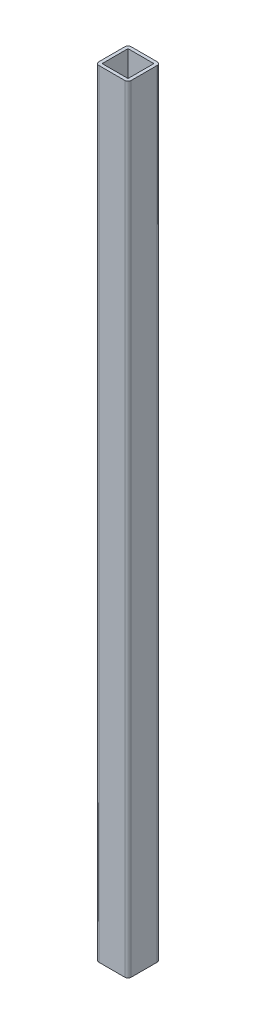
ISO-10303-21;
HEADER;
FILE_DESCRIPTION(('STEP AP214'),'2;1');
FILE_NAME('part.step','',(''),(''),'','','');
FILE_SCHEMA(('AUTOMOTIVE_DESIGN { 1 0 10303 214 1 1 1 1 }'));
ENDSEC;
DATA;
#1=APPLICATION_CONTEXT('core data for automotive mechanical design processes');
#2=APPLICATION_PROTOCOL_DEFINITION('international standard','automotive_design',2000,#1);
#3=PRODUCT_CONTEXT('',#1,'mechanical');
#4=PRODUCT('Part','Part','',(#3));
#5=PRODUCT_RELATED_PRODUCT_CATEGORY('part','',(#4));
#6=PRODUCT_DEFINITION_FORMATION('','',#4);
#7=PRODUCT_DEFINITION_CONTEXT('part definition',#1,'design');
#8=PRODUCT_DEFINITION('design','',#6,#7);
#9=PRODUCT_DEFINITION_SHAPE('','',#8);
#10=(LENGTH_UNIT() NAMED_UNIT(*) SI_UNIT(.MILLI.,.METRE.));
#11=(NAMED_UNIT(*) PLANE_ANGLE_UNIT() SI_UNIT($,.RADIAN.));
#12=(NAMED_UNIT(*) SI_UNIT($,.STERADIAN.) SOLID_ANGLE_UNIT());
#13=UNCERTAINTY_MEASURE_WITH_UNIT(LENGTH_MEASURE(1.E-05),#10,'distance_accuracy_value','');
#14=(GEOMETRIC_REPRESENTATION_CONTEXT(3) GLOBAL_UNCERTAINTY_ASSIGNED_CONTEXT((#13)) GLOBAL_UNIT_ASSIGNED_CONTEXT((#10,
#11,#12)) REPRESENTATION_CONTEXT('',''));
#15=CARTESIAN_POINT('',(0.,0.,0.));
#16=DIRECTION('',(0.,0.,1.));
#17=DIRECTION('',(1.,0.,0.));
#18=AXIS2_PLACEMENT_3D('',#15,#16,#17);
#19=CARTESIAN_POINT('',(12.7,609.6,-12.7));
#20=DIRECTION('',(0.,0.,1.));
#21=DIRECTION('',(1.,0.,0.));
#22=AXIS2_PLACEMENT_3D('',#19,#20,#21);
#23=PLANE('',#22);
#24=DIRECTION('',(-1.,0.,0.));
#25=VECTOR('',#24,1.);
#26=CARTESIAN_POINT('',(12.7,609.6,-12.7));
#27=LINE('',#26,#25);
#28=CARTESIAN_POINT('',(10.16,609.6,-12.7));
#29=VERTEX_POINT('',#28);
#30=CARTESIAN_POINT('',(-10.16,609.6,-12.7));
#31=VERTEX_POINT('',#30);
#32=EDGE_CURVE('E179',#29,#31,#27,.T.);
#33=ORIENTED_EDGE('',*,*,#32,.F.);
#34=DIRECTION('',(0.,-1.,0.));
#35=VECTOR('',#34,1.);
#36=CARTESIAN_POINT('',(10.16,0.,-12.7));
#37=LINE('',#36,#35);
#38=CARTESIAN_POINT('',(10.16,0.,-12.7));
#39=VERTEX_POINT('',#38);
#40=EDGE_CURVE('E11',#29,#39,#37,.T.);
#41=ORIENTED_EDGE('',*,*,#40,.T.);
#42=DIRECTION('',(-1.,0.,0.));
#43=VECTOR('',#42,1.);
#44=CARTESIAN_POINT('',(12.7,0.,-12.7));
#45=LINE('',#44,#43);
#46=CARTESIAN_POINT('',(-10.16,0.,-12.7));
#47=VERTEX_POINT('',#46);
#48=EDGE_CURVE('E196',#39,#47,#45,.T.);
#49=ORIENTED_EDGE('',*,*,#48,.T.);
#50=DIRECTION('',(0.,-1.,0.));
#51=VECTOR('',#50,1.);
#52=CARTESIAN_POINT('',(-10.16,609.6,-12.7));
#53=LINE('',#52,#51);
#54=EDGE_CURVE('E48',#47,#31,#53,.F.);
#55=ORIENTED_EDGE('',*,*,#54,.T.);
#56=EDGE_LOOP('',(#33,#41,#49,#55));
#57=FACE_BOUND('',#56,.T.);
#58=ADVANCED_FACE('F39',(#57),#23,.F.);
#59=CARTESIAN_POINT('',(-12.7,609.6,-12.7));
#60=DIRECTION('',(1.,0.,0.));
#61=DIRECTION('',(0.,0.,-1.));
#62=AXIS2_PLACEMENT_3D('',#59,#60,#61);
#63=PLANE('',#62);
#64=DIRECTION('',(0.,0.,1.));
#65=VECTOR('',#64,1.);
#66=CARTESIAN_POINT('',(-12.7,0.,-12.7));
#67=LINE('',#66,#65);
#68=CARTESIAN_POINT('',(-12.7,0.,-10.16));
#69=VERTEX_POINT('',#68);
#70=CARTESIAN_POINT('',(-12.7,0.,10.16));
#71=VERTEX_POINT('',#70);
#72=EDGE_CURVE('E200',#69,#71,#67,.T.);
#73=ORIENTED_EDGE('',*,*,#72,.T.);
#74=DIRECTION('',(0.,-1.,0.));
#75=VECTOR('',#74,1.);
#76=CARTESIAN_POINT('',(-12.7,609.6,10.16));
#77=LINE('',#76,#75);
#78=CARTESIAN_POINT('',(-12.7,609.6,10.16));
#79=VERTEX_POINT('',#78);
#80=EDGE_CURVE('E233',#71,#79,#77,.F.);
#81=ORIENTED_EDGE('',*,*,#80,.T.);
#82=DIRECTION('',(0.,0.,1.));
#83=VECTOR('',#82,1.);
#84=CARTESIAN_POINT('',(-12.7,609.6,-12.7));
#85=LINE('',#84,#83);
#86=CARTESIAN_POINT('',(-12.7,609.6,-10.16));
#87=VERTEX_POINT('',#86);
#88=EDGE_CURVE('E183',#87,#79,#85,.T.);
#89=ORIENTED_EDGE('',*,*,#88,.F.);
#90=DIRECTION('',(0.,-1.,0.));
#91=VECTOR('',#90,1.);
#92=CARTESIAN_POINT('',(-12.7,609.6,-10.16));
#93=LINE('',#92,#91);
#94=EDGE_CURVE('E229',#87,#69,#93,.T.);
#95=ORIENTED_EDGE('',*,*,#94,.T.);
#96=EDGE_LOOP('',(#73,#81,#89,#95));
#97=FACE_BOUND('',#96,.T.);
#98=ADVANCED_FACE('F266',(#97),#63,.F.);
#99=CARTESIAN_POINT('',(12.7,609.6,12.7));
#100=DIRECTION('',(0.,0.,1.));
#101=DIRECTION('',(1.,0.,0.));
#102=AXIS2_PLACEMENT_3D('',#99,#100,#101);
#103=PLANE('',#102);
#104=DIRECTION('',(-1.,0.,0.));
#105=VECTOR('',#104,1.);
#106=CARTESIAN_POINT('',(12.7,609.6,12.7));
#107=LINE('',#106,#105);
#108=CARTESIAN_POINT('',(10.16,609.6,12.7));
#109=VERTEX_POINT('',#108);
#110=CARTESIAN_POINT('',(-10.16,609.6,12.7));
#111=VERTEX_POINT('',#110);
#112=EDGE_CURVE('E188',#109,#111,#107,.T.);
#113=ORIENTED_EDGE('',*,*,#112,.T.);
#114=DIRECTION('',(0.,-1.,0.));
#115=VECTOR('',#114,1.);
#116=CARTESIAN_POINT('',(-10.16,0.,12.7));
#117=LINE('',#116,#115);
#118=CARTESIAN_POINT('',(-10.16,0.,12.7));
#119=VERTEX_POINT('',#118);
#120=EDGE_CURVE('E213',#111,#119,#117,.T.);
#121=ORIENTED_EDGE('',*,*,#120,.T.);
#122=DIRECTION('',(-1.,0.,0.));
#123=VECTOR('',#122,1.);
#124=CARTESIAN_POINT('',(12.7,0.,12.7));
#125=LINE('',#124,#123);
#126=CARTESIAN_POINT('',(10.16,0.,12.7));
#127=VERTEX_POINT('',#126);
#128=EDGE_CURVE('E204',#127,#119,#125,.T.);
#129=ORIENTED_EDGE('',*,*,#128,.F.);
#130=DIRECTION('',(0.,-1.,0.));
#131=VECTOR('',#130,1.);
#132=CARTESIAN_POINT('',(10.16,609.6,12.7));
#133=LINE('',#132,#131);
#134=EDGE_CURVE('E195',#127,#109,#133,.F.);
#135=ORIENTED_EDGE('',*,*,#134,.T.);
#136=EDGE_LOOP('',(#113,#121,#129,#135));
#137=FACE_BOUND('',#136,.T.);
#138=ADVANCED_FACE('F274',(#137),#103,.T.);
#139=CARTESIAN_POINT('',(12.7,609.6,-12.7));
#140=DIRECTION('',(1.,0.,0.));
#141=DIRECTION('',(0.,0.,-1.));
#142=AXIS2_PLACEMENT_3D('',#139,#140,#141);
#143=PLANE('',#142);
#144=DIRECTION('',(0.,0.,1.));
#145=VECTOR('',#144,1.);
#146=CARTESIAN_POINT('',(12.7,609.6,-12.7));
#147=LINE('',#146,#145);
#148=CARTESIAN_POINT('',(12.7,609.6,-10.16));
#149=VERTEX_POINT('',#148);
#150=CARTESIAN_POINT('',(12.7,609.6,10.16));
#151=VERTEX_POINT('',#150);
#152=EDGE_CURVE('E192',#149,#151,#147,.T.);
#153=ORIENTED_EDGE('',*,*,#152,.T.);
#154=DIRECTION('',(0.,-1.,0.));
#155=VECTOR('',#154,1.);
#156=CARTESIAN_POINT('',(12.7,609.6,10.16));
#157=LINE('',#156,#155);
#158=CARTESIAN_POINT('',(12.7,0.,10.16));
#159=VERTEX_POINT('',#158);
#160=EDGE_CURVE('E249',#151,#159,#157,.T.);
#161=ORIENTED_EDGE('',*,*,#160,.T.);
#162=DIRECTION('',(0.,0.,1.));
#163=VECTOR('',#162,1.);
#164=CARTESIAN_POINT('',(12.7,0.,-12.7));
#165=LINE('',#164,#163);
#166=CARTESIAN_POINT('',(12.7,0.,-10.16));
#167=VERTEX_POINT('',#166);
#168=EDGE_CURVE('E184',#167,#159,#165,.T.);
#169=ORIENTED_EDGE('',*,*,#168,.F.);
#170=DIRECTION('',(0.,-1.,0.));
#171=VECTOR('',#170,1.);
#172=CARTESIAN_POINT('',(12.7,609.6,-10.16));
#173=LINE('',#172,#171);
#174=EDGE_CURVE('E62',#167,#149,#173,.F.);
#175=ORIENTED_EDGE('',*,*,#174,.T.);
#176=EDGE_LOOP('',(#153,#161,#169,#175));
#177=FACE_BOUND('',#176,.T.);
#178=ADVANCED_FACE('F279',(#177),#143,.T.);
#179=CARTESIAN_POINT('',(0.,609.6,0.));
#180=DIRECTION('',(0.,1.,0.));
#181=DIRECTION('',(0.,0.,1.));
#182=AXIS2_PLACEMENT_3D('',#179,#180,#181);
#183=PLANE('',#182);
#184=DIRECTION('',(-1.,0.,0.));
#185=VECTOR('',#184,1.);
#186=CARTESIAN_POINT('',(12.7,609.6,-10.16));
#187=LINE('',#186,#185);
#188=CARTESIAN_POINT('',(10.16,609.6,-10.16));
#189=VERTEX_POINT('',#188);
#190=CARTESIAN_POINT('',(-10.16,609.6,-10.16));
#191=VERTEX_POINT('',#190);
#192=EDGE_CURVE('E160',#189,#191,#187,.T.);
#193=ORIENTED_EDGE('',*,*,#192,.F.);
#194=DIRECTION('',(0.,0.,1.));
#195=VECTOR('',#194,1.);
#196=CARTESIAN_POINT('',(10.16,609.6,-12.7));
#197=LINE('',#196,#195);
#198=CARTESIAN_POINT('',(10.16,609.6,10.16));
#199=VERTEX_POINT('',#198);
#200=EDGE_CURVE('E139',#189,#199,#197,.T.);
#201=ORIENTED_EDGE('',*,*,#200,.T.);
#202=DIRECTION('',(-1.,0.,0.));
#203=VECTOR('',#202,1.);
#204=CARTESIAN_POINT('',(12.7,609.6,10.16));
#205=LINE('',#204,#203);
#206=CARTESIAN_POINT('',(-10.16,609.6,10.16));
#207=VERTEX_POINT('',#206);
#208=EDGE_CURVE('E173',#199,#207,#205,.T.);
#209=ORIENTED_EDGE('',*,*,#208,.T.);
#210=DIRECTION('',(0.,0.,1.));
#211=VECTOR('',#210,1.);
#212=CARTESIAN_POINT('',(-10.16,609.6,-12.7));
#213=LINE('',#212,#211);
#214=EDGE_CURVE('E164',#191,#207,#213,.T.);
#215=ORIENTED_EDGE('',*,*,#214,.F.);
#216=EDGE_LOOP('',(#193,#201,#209,#215));
#217=FACE_BOUND('',#216,.T.);
#218=ORIENTED_EDGE('',*,*,#88,.T.);
#219=CARTESIAN_POINT('',(-10.16,609.6,10.16));
#220=DIRECTION('',(0.,1.,0.));
#221=DIRECTION('',(0.,0.,1.));
#222=AXIS2_PLACEMENT_3D('',#219,#220,#221);
#223=CIRCLE('',#222,2.54);
#224=EDGE_CURVE('E244',#79,#111,#223,.T.);
#225=ORIENTED_EDGE('',*,*,#224,.T.);
#226=ORIENTED_EDGE('',*,*,#112,.F.);
#227=CARTESIAN_POINT('',(10.16,609.6,10.16));
#228=DIRECTION('',(0.,1.,0.));
#229=DIRECTION('',(0.,0.,1.));
#230=AXIS2_PLACEMENT_3D('',#227,#228,#229);
#231=CIRCLE('',#230,2.54);
#232=EDGE_CURVE('E55',#109,#151,#231,.T.);
#233=ORIENTED_EDGE('',*,*,#232,.T.);
#234=ORIENTED_EDGE('',*,*,#152,.F.);
#235=CARTESIAN_POINT('',(10.16,609.6,-10.16));
#236=DIRECTION('',(0.,1.,0.));
#237=DIRECTION('',(0.,0.,1.));
#238=AXIS2_PLACEMENT_3D('',#235,#236,#237);
#239=CIRCLE('',#238,2.54);
#240=EDGE_CURVE('E239',#149,#29,#239,.T.);
#241=ORIENTED_EDGE('',*,*,#240,.T.);
#242=ORIENTED_EDGE('',*,*,#32,.T.);
#243=CARTESIAN_POINT('',(-10.16,609.6,-10.16));
#244=DIRECTION('',(0.,1.,0.));
#245=DIRECTION('',(0.,0.,1.));
#246=AXIS2_PLACEMENT_3D('',#243,#244,#245);
#247=CIRCLE('',#246,2.54);
#248=EDGE_CURVE('E236',#31,#87,#247,.T.);
#249=ORIENTED_EDGE('',*,*,#248,.T.);
#250=EDGE_LOOP('',(#218,#225,#226,#233,#234,#241,#242,#249));
#251=FACE_BOUND('',#250,.T.);
#252=ADVANCED_FACE('F260',(#217,#251),#183,.T.);
#253=CARTESIAN_POINT('',(0.,0.,0.));
#254=DIRECTION('',(0.,1.,0.));
#255=DIRECTION('',(0.,0.,1.));
#256=AXIS2_PLACEMENT_3D('',#253,#254,#255);
#257=PLANE('',#256);
#258=DIRECTION('',(0.,0.,1.));
#259=VECTOR('',#258,1.);
#260=CARTESIAN_POINT('',(10.16,0.,-12.7));
#261=LINE('',#260,#259);
#262=CARTESIAN_POINT('',(10.16,0.,-10.16));
#263=VERTEX_POINT('',#262);
#264=CARTESIAN_POINT('',(10.16,0.,10.16));
#265=VERTEX_POINT('',#264);
#266=EDGE_CURVE('E136',#263,#265,#261,.T.);
#267=ORIENTED_EDGE('',*,*,#266,.F.);
#268=DIRECTION('',(-1.,0.,0.));
#269=VECTOR('',#268,1.);
#270=CARTESIAN_POINT('',(12.7,0.,-10.16));
#271=LINE('',#270,#269);
#272=CARTESIAN_POINT('',(-10.16,0.,-10.16));
#273=VERTEX_POINT('',#272);
#274=EDGE_CURVE('E147',#263,#273,#271,.T.);
#275=ORIENTED_EDGE('',*,*,#274,.T.);
#276=DIRECTION('',(0.,0.,1.));
#277=VECTOR('',#276,1.);
#278=CARTESIAN_POINT('',(-10.16,0.,-12.7));
#279=LINE('',#278,#277);
#280=CARTESIAN_POINT('',(-10.16,0.,10.16));
#281=VERTEX_POINT('',#280);
#282=EDGE_CURVE('E154',#273,#281,#279,.T.);
#283=ORIENTED_EDGE('',*,*,#282,.T.);
#284=DIRECTION('',(-1.,0.,0.));
#285=VECTOR('',#284,1.);
#286=CARTESIAN_POINT('',(12.7,0.,10.16));
#287=LINE('',#286,#285);
#288=EDGE_CURVE('E158',#265,#281,#287,.T.);
#289=ORIENTED_EDGE('',*,*,#288,.F.);
#290=EDGE_LOOP('',(#267,#275,#283,#289));
#291=FACE_BOUND('',#290,.T.);
#292=ORIENTED_EDGE('',*,*,#128,.T.);
#293=CARTESIAN_POINT('',(-10.16,0.,10.16));
#294=DIRECTION('',(0.,1.,0.));
#295=DIRECTION('',(0.,0.,1.));
#296=AXIS2_PLACEMENT_3D('',#293,#294,#295);
#297=CIRCLE('',#296,2.54);
#298=EDGE_CURVE('E226',#119,#71,#297,.F.);
#299=ORIENTED_EDGE('',*,*,#298,.T.);
#300=ORIENTED_EDGE('',*,*,#72,.F.);
#301=CARTESIAN_POINT('',(-10.16,0.,-10.16));
#302=DIRECTION('',(0.,1.,0.));
#303=DIRECTION('',(0.,0.,1.));
#304=AXIS2_PLACEMENT_3D('',#301,#302,#303);
#305=CIRCLE('',#304,2.54);
#306=EDGE_CURVE('E217',#69,#47,#305,.F.);
#307=ORIENTED_EDGE('',*,*,#306,.T.);
#308=ORIENTED_EDGE('',*,*,#48,.F.);
#309=CARTESIAN_POINT('',(10.16,0.,-10.16));
#310=DIRECTION('',(0.,1.,0.));
#311=DIRECTION('',(0.,0.,1.));
#312=AXIS2_PLACEMENT_3D('',#309,#310,#311);
#313=CIRCLE('',#312,2.54);
#314=EDGE_CURVE('E220',#39,#167,#313,.F.);
#315=ORIENTED_EDGE('',*,*,#314,.T.);
#316=ORIENTED_EDGE('',*,*,#168,.T.);
#317=CARTESIAN_POINT('',(10.16,0.,10.16));
#318=DIRECTION('',(0.,1.,0.));
#319=DIRECTION('',(0.,0.,1.));
#320=AXIS2_PLACEMENT_3D('',#317,#318,#319);
#321=CIRCLE('',#320,2.54);
#322=EDGE_CURVE('E223',#159,#127,#321,.F.);
#323=ORIENTED_EDGE('',*,*,#322,.T.);
#324=EDGE_LOOP('',(#292,#299,#300,#307,#308,#315,#316,#323));
#325=FACE_BOUND('',#324,.T.);
#326=ADVANCED_FACE('F156',(#291,#325),#257,.F.);
#327=CARTESIAN_POINT('',(12.7,609.6,-10.16));
#328=DIRECTION('',(0.,0.,1.));
#329=DIRECTION('',(1.,0.,0.));
#330=AXIS2_PLACEMENT_3D('',#327,#328,#329);
#331=PLANE('',#330);
#332=ORIENTED_EDGE('',*,*,#274,.F.);
#333=DIRECTION('',(0.,-1.,0.));
#334=VECTOR('',#333,1.);
#335=CARTESIAN_POINT('',(10.16,609.6,-10.16));
#336=LINE('',#335,#334);
#337=EDGE_CURVE('E131',#189,#263,#336,.T.);
#338=ORIENTED_EDGE('',*,*,#337,.F.);
#339=ORIENTED_EDGE('',*,*,#192,.T.);
#340=DIRECTION('',(0.,-1.,0.));
#341=VECTOR('',#340,1.);
#342=CARTESIAN_POINT('',(-10.16,609.6,-10.16));
#343=LINE('',#342,#341);
#344=EDGE_CURVE('E150',#191,#273,#343,.T.);
#345=ORIENTED_EDGE('',*,*,#344,.T.);
#346=EDGE_LOOP('',(#332,#338,#339,#345));
#347=FACE_BOUND('',#346,.T.);
#348=ADVANCED_FACE('F148',(#347),#331,.T.);
#349=CARTESIAN_POINT('',(-10.16,609.6,-12.7));
#350=DIRECTION('',(1.,0.,0.));
#351=DIRECTION('',(0.,0.,-1.));
#352=AXIS2_PLACEMENT_3D('',#349,#350,#351);
#353=PLANE('',#352);
#354=ORIENTED_EDGE('',*,*,#282,.F.);
#355=ORIENTED_EDGE('',*,*,#344,.F.);
#356=ORIENTED_EDGE('',*,*,#214,.T.);
#357=DIRECTION('',(0.,-1.,0.));
#358=VECTOR('',#357,1.);
#359=CARTESIAN_POINT('',(-10.16,609.6,10.16));
#360=LINE('',#359,#358);
#361=EDGE_CURVE('E400',#207,#281,#360,.T.);
#362=ORIENTED_EDGE('',*,*,#361,.T.);
#363=EDGE_LOOP('',(#354,#355,#356,#362));
#364=FACE_BOUND('',#363,.T.);
#365=ADVANCED_FACE('F305',(#364),#353,.T.);
#366=CARTESIAN_POINT('',(12.7,609.6,10.16));
#367=DIRECTION('',(0.,0.,1.));
#368=DIRECTION('',(1.,0.,0.));
#369=AXIS2_PLACEMENT_3D('',#366,#367,#368);
#370=PLANE('',#369);
#371=ORIENTED_EDGE('',*,*,#288,.T.);
#372=ORIENTED_EDGE('',*,*,#361,.F.);
#373=ORIENTED_EDGE('',*,*,#208,.F.);
#374=DIRECTION('',(0.,-1.,0.));
#375=VECTOR('',#374,1.);
#376=CARTESIAN_POINT('',(10.16,609.6,10.16));
#377=LINE('',#376,#375);
#378=EDGE_CURVE('E143',#199,#265,#377,.T.);
#379=ORIENTED_EDGE('',*,*,#378,.T.);
#380=EDGE_LOOP('',(#371,#372,#373,#379));
#381=FACE_BOUND('',#380,.T.);
#382=ADVANCED_FACE('F300',(#381),#370,.F.);
#383=CARTESIAN_POINT('',(10.16,609.6,-12.7));
#384=DIRECTION('',(1.,0.,0.));
#385=DIRECTION('',(0.,0.,-1.));
#386=AXIS2_PLACEMENT_3D('',#383,#384,#385);
#387=PLANE('',#386);
#388=ORIENTED_EDGE('',*,*,#266,.T.);
#389=ORIENTED_EDGE('',*,*,#378,.F.);
#390=ORIENTED_EDGE('',*,*,#200,.F.);
#391=ORIENTED_EDGE('',*,*,#337,.T.);
#392=EDGE_LOOP('',(#388,#389,#390,#391));
#393=FACE_BOUND('',#392,.T.);
#394=ADVANCED_FACE('F133',(#393),#387,.F.);
#395=CARTESIAN_POINT('',(-10.16,609.6,10.16));
#396=DIRECTION('',(0.,1.,0.));
#397=DIRECTION('',(0.,0.,1.));
#398=AXIS2_PLACEMENT_3D('',#395,#396,#397);
#399=CYLINDRICAL_SURFACE('',#398,2.54);
#400=ORIENTED_EDGE('',*,*,#224,.F.);
#401=ORIENTED_EDGE('',*,*,#80,.F.);
#402=ORIENTED_EDGE('',*,*,#298,.F.);
#403=ORIENTED_EDGE('',*,*,#120,.F.);
#404=EDGE_LOOP('',(#400,#401,#402,#403));
#405=FACE_BOUND('',#404,.T.);
#406=ADVANCED_FACE('F272',(#405),#399,.T.);
#407=CARTESIAN_POINT('',(10.16,609.6,10.16));
#408=DIRECTION('',(0.,-1.,0.));
#409=DIRECTION('',(0.,0.,-1.));
#410=AXIS2_PLACEMENT_3D('',#407,#408,#409);
#411=CYLINDRICAL_SURFACE('',#410,2.54);
#412=ORIENTED_EDGE('',*,*,#232,.F.);
#413=ORIENTED_EDGE('',*,*,#134,.F.);
#414=ORIENTED_EDGE('',*,*,#322,.F.);
#415=ORIENTED_EDGE('',*,*,#160,.F.);
#416=EDGE_LOOP('',(#412,#413,#414,#415));
#417=FACE_BOUND('',#416,.T.);
#418=ADVANCED_FACE('F278',(#417),#411,.T.);
#419=CARTESIAN_POINT('',(10.16,609.6,-10.16));
#420=DIRECTION('',(0.,1.,0.));
#421=DIRECTION('',(0.,0.,1.));
#422=AXIS2_PLACEMENT_3D('',#419,#420,#421);
#423=CYLINDRICAL_SURFACE('',#422,2.54);
#424=ORIENTED_EDGE('',*,*,#240,.F.);
#425=ORIENTED_EDGE('',*,*,#174,.F.);
#426=ORIENTED_EDGE('',*,*,#314,.F.);
#427=ORIENTED_EDGE('',*,*,#40,.F.);
#428=EDGE_LOOP('',(#424,#425,#426,#427));
#429=FACE_BOUND('',#428,.T.);
#430=ADVANCED_FACE('F281',(#429),#423,.T.);
#431=CARTESIAN_POINT('',(-10.16,609.6,-10.16));
#432=DIRECTION('',(0.,-1.,0.));
#433=DIRECTION('',(0.,0.,-1.));
#434=AXIS2_PLACEMENT_3D('',#431,#432,#433);
#435=CYLINDRICAL_SURFACE('',#434,2.54);
#436=ORIENTED_EDGE('',*,*,#248,.F.);
#437=ORIENTED_EDGE('',*,*,#54,.F.);
#438=ORIENTED_EDGE('',*,*,#306,.F.);
#439=ORIENTED_EDGE('',*,*,#94,.F.);
#440=EDGE_LOOP('',(#436,#437,#438,#439));
#441=FACE_BOUND('',#440,.T.);
#442=ADVANCED_FACE('F41',(#441),#435,.T.);
#443=CLOSED_SHELL('',(#58,#98,#138,#178,#252,#326,#348,#365,#382,#394,#406,#418,#430,#442));
#444=MANIFOLD_SOLID_BREP('B2',#443);
#445=ADVANCED_BREP_SHAPE_REPRESENTATION('',(#18,#444),#14);
#446=SHAPE_DEFINITION_REPRESENTATION(#9,#445);
ENDSEC;
END-ISO-10303-21;
